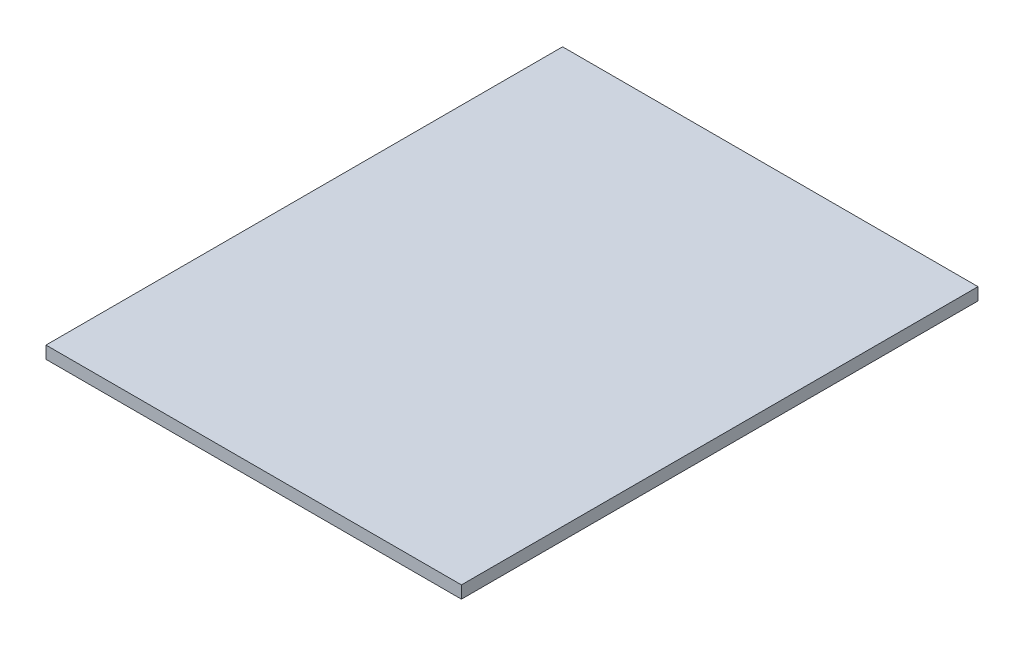
ISO-10303-21;
HEADER;
FILE_DESCRIPTION(('STEP AP214'),'2;1');
FILE_NAME('part.step','',(''),(''),'','','');
FILE_SCHEMA(('AUTOMOTIVE_DESIGN { 1 0 10303 214 1 1 1 1 }'));
ENDSEC;
DATA;
#1=APPLICATION_CONTEXT('core data for automotive mechanical design processes');
#2=APPLICATION_PROTOCOL_DEFINITION('international standard','automotive_design',2000,#1);
#3=PRODUCT_CONTEXT('',#1,'mechanical');
#4=PRODUCT('Part','Part','',(#3));
#5=PRODUCT_RELATED_PRODUCT_CATEGORY('part','',(#4));
#6=PRODUCT_DEFINITION_FORMATION('','',#4);
#7=PRODUCT_DEFINITION_CONTEXT('part definition',#1,'design');
#8=PRODUCT_DEFINITION('design','',#6,#7);
#9=PRODUCT_DEFINITION_SHAPE('','',#8);
#10=(LENGTH_UNIT() NAMED_UNIT(*) SI_UNIT(.MILLI.,.METRE.));
#11=(NAMED_UNIT(*) PLANE_ANGLE_UNIT() SI_UNIT($,.RADIAN.));
#12=(NAMED_UNIT(*) SI_UNIT($,.STERADIAN.) SOLID_ANGLE_UNIT());
#13=UNCERTAINTY_MEASURE_WITH_UNIT(LENGTH_MEASURE(1.E-05),#10,'distance_accuracy_value','');
#14=(GEOMETRIC_REPRESENTATION_CONTEXT(3) GLOBAL_UNCERTAINTY_ASSIGNED_CONTEXT((#13)) GLOBAL_UNIT_ASSIGNED_CONTEXT((#10,
#11,#12)) REPRESENTATION_CONTEXT('',''));
#15=CARTESIAN_POINT('',(0.,0.,0.));
#16=DIRECTION('',(0.,0.,1.));
#17=DIRECTION('',(1.,0.,0.));
#18=AXIS2_PLACEMENT_3D('',#15,#16,#17);
#19=CARTESIAN_POINT('',(306.3875,18.288,381.));
#20=DIRECTION('',(-1.,0.,0.));
#21=DIRECTION('',(0.,0.,1.));
#22=AXIS2_PLACEMENT_3D('',#19,#20,#21);
#23=PLANE('',#22);
#24=DIRECTION('',(0.,0.,-1.));
#25=VECTOR('',#24,1.);
#26=CARTESIAN_POINT('',(306.3875,0.,381.));
#27=LINE('',#26,#25);
#28=CARTESIAN_POINT('',(306.3875,0.,381.));
#29=VERTEX_POINT('',#28);
#30=CARTESIAN_POINT('',(306.3875,0.,-381.));
#31=VERTEX_POINT('',#30);
#32=EDGE_CURVE('E98',#29,#31,#27,.T.);
#33=ORIENTED_EDGE('',*,*,#32,.T.);
#34=DIRECTION('',(0.,-1.,0.));
#35=VECTOR('',#34,1.);
#36=CARTESIAN_POINT('',(306.3875,18.288,-381.));
#37=LINE('',#36,#35);
#38=CARTESIAN_POINT('',(306.3875,18.288,-381.));
#39=VERTEX_POINT('',#38);
#40=EDGE_CURVE('E11',#39,#31,#37,.T.);
#41=ORIENTED_EDGE('',*,*,#40,.F.);
#42=DIRECTION('',(0.,0.,-1.));
#43=VECTOR('',#42,1.);
#44=CARTESIAN_POINT('',(306.3875,18.288,381.));
#45=LINE('',#44,#43);
#46=CARTESIAN_POINT('',(306.3875,18.288,381.));
#47=VERTEX_POINT('',#46);
#48=EDGE_CURVE('E86',#47,#39,#45,.T.);
#49=ORIENTED_EDGE('',*,*,#48,.F.);
#50=DIRECTION('',(0.,-1.,0.));
#51=VECTOR('',#50,1.);
#52=CARTESIAN_POINT('',(306.3875,18.288,381.));
#53=LINE('',#52,#51);
#54=EDGE_CURVE('E94',#47,#29,#53,.T.);
#55=ORIENTED_EDGE('',*,*,#54,.T.);
#56=EDGE_LOOP('',(#33,#41,#49,#55));
#57=FACE_BOUND('',#56,.T.);
#58=ADVANCED_FACE('F35',(#57),#23,.F.);
#59=CARTESIAN_POINT('',(-306.3875,18.288,-381.));
#60=DIRECTION('',(0.,0.,1.));
#61=DIRECTION('',(1.,0.,0.));
#62=AXIS2_PLACEMENT_3D('',#59,#60,#61);
#63=PLANE('',#62);
#64=DIRECTION('',(-1.,0.,0.));
#65=VECTOR('',#64,1.);
#66=CARTESIAN_POINT('',(-306.3875,0.,-381.));
#67=LINE('',#66,#65);
#68=CARTESIAN_POINT('',(-306.3875,0.,-381.));
#69=VERTEX_POINT('',#68);
#70=EDGE_CURVE('E90',#31,#69,#67,.T.);
#71=ORIENTED_EDGE('',*,*,#70,.T.);
#72=DIRECTION('',(0.,-1.,0.));
#73=VECTOR('',#72,1.);
#74=CARTESIAN_POINT('',(-306.3875,18.288,-381.));
#75=LINE('',#74,#73);
#76=CARTESIAN_POINT('',(-306.3875,18.288,-381.));
#77=VERTEX_POINT('',#76);
#78=EDGE_CURVE('E43',#77,#69,#75,.T.);
#79=ORIENTED_EDGE('',*,*,#78,.F.);
#80=DIRECTION('',(-1.,0.,0.));
#81=VECTOR('',#80,1.);
#82=CARTESIAN_POINT('',(-306.3875,18.288,-381.));
#83=LINE('',#82,#81);
#84=EDGE_CURVE('E81',#39,#77,#83,.T.);
#85=ORIENTED_EDGE('',*,*,#84,.F.);
#86=ORIENTED_EDGE('',*,*,#40,.T.);
#87=EDGE_LOOP('',(#71,#79,#85,#86));
#88=FACE_BOUND('',#87,.T.);
#89=ADVANCED_FACE('F89',(#88),#63,.F.);
#90=CARTESIAN_POINT('',(-306.3875,18.288,381.));
#91=DIRECTION('',(1.,0.,0.));
#92=DIRECTION('',(0.,0.,-1.));
#93=AXIS2_PLACEMENT_3D('',#90,#91,#92);
#94=PLANE('',#93);
#95=DIRECTION('',(0.,0.,1.));
#96=VECTOR('',#95,1.);
#97=CARTESIAN_POINT('',(-306.3875,0.,381.));
#98=LINE('',#97,#96);
#99=CARTESIAN_POINT('',(-306.3875,0.,381.));
#100=VERTEX_POINT('',#99);
#101=EDGE_CURVE('E68',#69,#100,#98,.T.);
#102=ORIENTED_EDGE('',*,*,#101,.T.);
#103=DIRECTION('',(0.,-1.,0.));
#104=VECTOR('',#103,1.);
#105=CARTESIAN_POINT('',(-306.3875,18.288,381.));
#106=LINE('',#105,#104);
#107=CARTESIAN_POINT('',(-306.3875,18.288,381.));
#108=VERTEX_POINT('',#107);
#109=EDGE_CURVE('E91',#108,#100,#106,.T.);
#110=ORIENTED_EDGE('',*,*,#109,.F.);
#111=DIRECTION('',(0.,0.,1.));
#112=VECTOR('',#111,1.);
#113=CARTESIAN_POINT('',(-306.3875,18.288,381.));
#114=LINE('',#113,#112);
#115=EDGE_CURVE('E84',#77,#108,#114,.T.);
#116=ORIENTED_EDGE('',*,*,#115,.F.);
#117=ORIENTED_EDGE('',*,*,#78,.T.);
#118=EDGE_LOOP('',(#102,#110,#116,#117));
#119=FACE_BOUND('',#118,.T.);
#120=ADVANCED_FACE('F92',(#119),#94,.F.);
#121=CARTESIAN_POINT('',(-306.3875,18.288,381.));
#122=DIRECTION('',(0.,0.,-1.));
#123=DIRECTION('',(-1.,0.,0.));
#124=AXIS2_PLACEMENT_3D('',#121,#122,#123);
#125=PLANE('',#124);
#126=DIRECTION('',(1.,0.,0.));
#127=VECTOR('',#126,1.);
#128=CARTESIAN_POINT('',(-306.3875,0.,381.));
#129=LINE('',#128,#127);
#130=EDGE_CURVE('E74',#100,#29,#129,.T.);
#131=ORIENTED_EDGE('',*,*,#130,.T.);
#132=ORIENTED_EDGE('',*,*,#54,.F.);
#133=DIRECTION('',(1.,0.,0.));
#134=VECTOR('',#133,1.);
#135=CARTESIAN_POINT('',(-306.3875,18.288,381.));
#136=LINE('',#135,#134);
#137=EDGE_CURVE('E51',#108,#47,#136,.T.);
#138=ORIENTED_EDGE('',*,*,#137,.F.);
#139=ORIENTED_EDGE('',*,*,#109,.T.);
#140=EDGE_LOOP('',(#131,#132,#138,#139));
#141=FACE_BOUND('',#140,.T.);
#142=ADVANCED_FACE('F105',(#141),#125,.F.);
#143=CARTESIAN_POINT('',(0.,18.288,0.));
#144=DIRECTION('',(0.,-1.,0.));
#145=DIRECTION('',(0.,0.,-1.));
#146=AXIS2_PLACEMENT_3D('',#143,#144,#145);
#147=PLANE('',#146);
#148=ORIENTED_EDGE('',*,*,#48,.T.);
#149=ORIENTED_EDGE('',*,*,#84,.T.);
#150=ORIENTED_EDGE('',*,*,#115,.T.);
#151=ORIENTED_EDGE('',*,*,#137,.T.);
#152=EDGE_LOOP('',(#148,#149,#150,#151));
#153=FACE_BOUND('',#152,.T.);
#154=ADVANCED_FACE('F82',(#153),#147,.F.);
#155=CARTESIAN_POINT('',(0.,0.,0.));
#156=DIRECTION('',(0.,-1.,0.));
#157=DIRECTION('',(0.,0.,-1.));
#158=AXIS2_PLACEMENT_3D('',#155,#156,#157);
#159=PLANE('',#158);
#160=ORIENTED_EDGE('',*,*,#32,.F.);
#161=ORIENTED_EDGE('',*,*,#130,.F.);
#162=ORIENTED_EDGE('',*,*,#101,.F.);
#163=ORIENTED_EDGE('',*,*,#70,.F.);
#164=EDGE_LOOP('',(#160,#161,#162,#163));
#165=FACE_BOUND('',#164,.T.);
#166=ADVANCED_FACE('F108',(#165),#159,.T.);
#167=CLOSED_SHELL('',(#58,#89,#120,#142,#154,#166));
#168=MANIFOLD_SOLID_BREP('B2',#167);
#169=ADVANCED_BREP_SHAPE_REPRESENTATION('',(#18,#168),#14);
#170=SHAPE_DEFINITION_REPRESENTATION(#9,#169);
ENDSEC;
END-ISO-10303-21;
